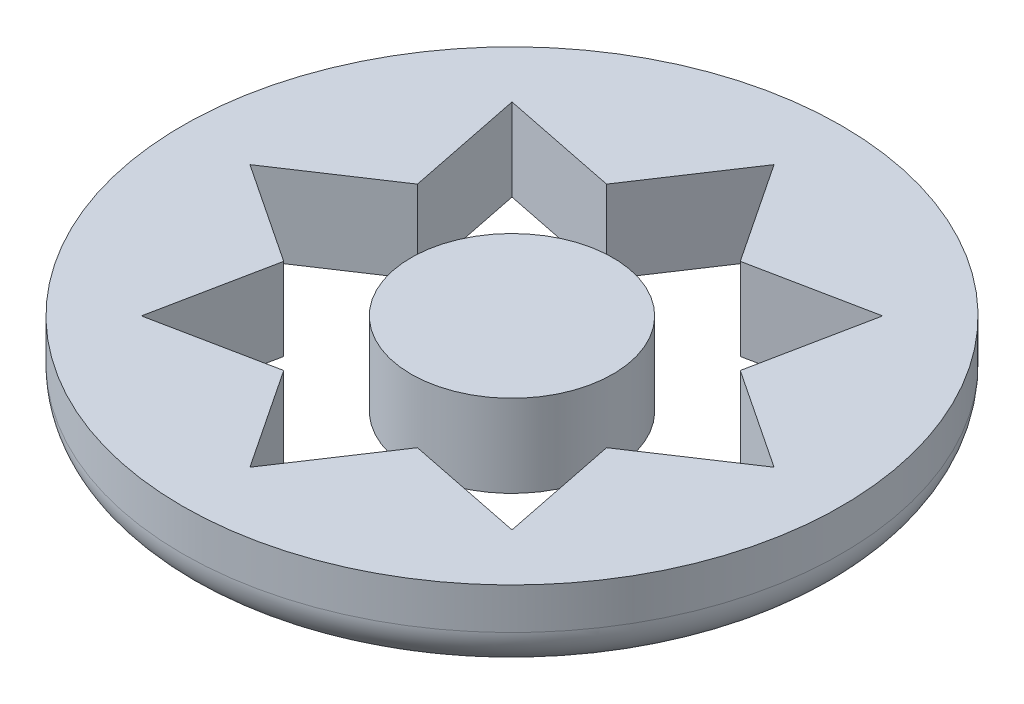
ISO-10303-21;
HEADER;
FILE_DESCRIPTION(('STEP AP214'),'2;1');
FILE_NAME('part.step','',(''),(''),'','','');
FILE_SCHEMA(('AUTOMOTIVE_DESIGN { 1 0 10303 214 1 1 1 1 }'));
ENDSEC;
DATA;
#1=APPLICATION_CONTEXT('core data for automotive mechanical design processes');
#2=APPLICATION_PROTOCOL_DEFINITION('international standard','automotive_design',2000,#1);
#3=PRODUCT_CONTEXT('',#1,'mechanical');
#4=PRODUCT('Part','Part','',(#3));
#5=PRODUCT_RELATED_PRODUCT_CATEGORY('part','',(#4));
#6=PRODUCT_DEFINITION_FORMATION('','',#4);
#7=PRODUCT_DEFINITION_CONTEXT('part definition',#1,'design');
#8=PRODUCT_DEFINITION('design','',#6,#7);
#9=PRODUCT_DEFINITION_SHAPE('','',#8);
#10=(LENGTH_UNIT() NAMED_UNIT(*) SI_UNIT(.MILLI.,.METRE.));
#11=(NAMED_UNIT(*) PLANE_ANGLE_UNIT() SI_UNIT($,.RADIAN.));
#12=(NAMED_UNIT(*) SI_UNIT($,.STERADIAN.) SOLID_ANGLE_UNIT());
#13=UNCERTAINTY_MEASURE_WITH_UNIT(LENGTH_MEASURE(1.E-05),#10,'distance_accuracy_value','');
#14=(GEOMETRIC_REPRESENTATION_CONTEXT(3) GLOBAL_UNCERTAINTY_ASSIGNED_CONTEXT((#13)) GLOBAL_UNIT_ASSIGNED_CONTEXT((#10,
#11,#12)) REPRESENTATION_CONTEXT('',''));
#15=CARTESIAN_POINT('',(0.,0.,0.));
#16=DIRECTION('',(0.,0.,1.));
#17=DIRECTION('',(1.,0.,0.));
#18=AXIS2_PLACEMENT_3D('',#15,#16,#17);
#19=CARTESIAN_POINT('',(0.,-6.92964645562817,0.));
#20=DIRECTION('',(0.,1.,0.));
#21=DIRECTION('',(0.,0.,1.));
#22=AXIS2_PLACEMENT_3D('',#19,#20,#21);
#23=CYLINDRICAL_SURFACE('',#22,2.45);
#24=CARTESIAN_POINT('',(0.,0.,0.));
#25=DIRECTION('',(0.,1.,0.));
#26=DIRECTION('',(0.,0.,1.));
#27=AXIS2_PLACEMENT_3D('',#24,#25,#26);
#28=CIRCLE('',#27,2.45);
#29=CARTESIAN_POINT('',(0.,0.,2.45));
#30=VERTEX_POINT('',#29);
#31=EDGE_CURVE('E11',#30,#30,#28,.F.);
#32=ORIENTED_EDGE('',*,*,#31,.F.);
#33=EDGE_LOOP('',(#32));
#34=FACE_BOUND('',#33,.T.);
#35=CARTESIAN_POINT('',(0.,2.,0.));
#36=DIRECTION('',(0.,1.,0.));
#37=DIRECTION('',(0.,0.,1.));
#38=AXIS2_PLACEMENT_3D('',#35,#36,#37);
#39=CIRCLE('',#38,2.45);
#40=CARTESIAN_POINT('',(0.,2.,2.45));
#41=VERTEX_POINT('',#40);
#42=EDGE_CURVE('E46',#41,#41,#39,.T.);
#43=ORIENTED_EDGE('',*,*,#42,.F.);
#44=EDGE_LOOP('',(#43));
#45=FACE_BOUND('',#44,.T.);
#46=ADVANCED_FACE('F40',(#34,#45),#23,.T.);
#47=CARTESIAN_POINT('',(0.,2.,0.));
#48=DIRECTION('',(0.,1.,0.));
#49=DIRECTION('',(0.,0.,1.));
#50=AXIS2_PLACEMENT_3D('',#47,#48,#49);
#51=PLANE('',#50);
#52=ORIENTED_EDGE('',*,*,#42,.T.);
#53=EDGE_LOOP('',(#52));
#54=FACE_BOUND('',#53,.T.);
#55=ADVANCED_FACE('F52',(#54),#51,.T.);
#56=CARTESIAN_POINT('',(0.,0.,0.));
#57=DIRECTION('',(0.,1.,0.));
#58=DIRECTION('',(0.,0.,1.));
#59=AXIS2_PLACEMENT_3D('',#56,#57,#58);
#60=PLANE('',#59);
#61=ORIENTED_EDGE('',*,*,#31,.T.);
#62=EDGE_LOOP('',(#61));
#63=FACE_BOUND('',#62,.T.);
#64=ADVANCED_FACE('F59',(#63),#60,.F.);
#65=CLOSED_SHELL('',(#46,#55,#64));
#66=MANIFOLD_SOLID_BREP('B2',#65);
#67=CARTESIAN_POINT('',(0.,2.,0.));
#68=DIRECTION('',(0.,1.,0.));
#69=DIRECTION('',(0.,0.,1.));
#70=AXIS2_PLACEMENT_3D('',#67,#68,#69);
#71=PLANE('',#70);
#72=CARTESIAN_POINT('',(0.,2.,0.));
#73=DIRECTION('',(0.,1.,0.));
#74=DIRECTION('',(0.,0.,1.));
#75=AXIS2_PLACEMENT_3D('',#72,#73,#74);
#76=CIRCLE('',#75,8.);
#77=CARTESIAN_POINT('',(0.,2.,8.));
#78=VERTEX_POINT('',#77);
#79=EDGE_CURVE('E209',#78,#78,#76,.T.);
#80=ORIENTED_EDGE('',*,*,#79,.T.);
#81=EDGE_LOOP('',(#80));
#82=FACE_BOUND('',#81,.T.);
#83=DIRECTION('',(0.832981275735844,0.,0.553301178630126));
#84=VECTOR('',#83,1.);
#85=CARTESIAN_POINT('',(-3.91815264163819,2.,1.62295196361452));
#86=LINE('',#85,#84);
#87=CARTESIAN_POINT('',(-6.36146678829633,2.,0.));
#88=VERTEX_POINT('',#87);
#89=CARTESIAN_POINT('',(-3.91815264163819,2.,1.62295196361452));
#90=VERTEX_POINT('',#89);
#91=EDGE_CURVE('E201',#88,#90,#86,.T.);
#92=ORIENTED_EDGE('',*,*,#91,.F.);
#93=DIRECTION('',(-0.832981275735844,0.,0.553301178630126));
#94=VECTOR('',#93,1.);
#95=CARTESIAN_POINT('',(-6.36146678829633,2.,0.));
#96=LINE('',#95,#94);
#97=CARTESIAN_POINT('',(-3.91815264163819,2.,-1.6229519636145));
#98=VERTEX_POINT('',#97);
#99=EDGE_CURVE('E193',#98,#88,#96,.T.);
#100=ORIENTED_EDGE('',*,*,#99,.F.);
#101=DIRECTION('',(0.197763693226366,0.,0.980249724122107));
#102=VECTOR('',#101,1.);
#103=CARTESIAN_POINT('',(-3.91815264163819,2.,-1.6229519636145));
#104=LINE('',#103,#102);
#105=CARTESIAN_POINT('',(-4.49823630429734,2.,-4.49823630429733));
#106=VERTEX_POINT('',#105);
#107=EDGE_CURVE('E242',#106,#98,#104,.T.);
#108=ORIENTED_EDGE('',*,*,#107,.F.);
#109=DIRECTION('',(-0.980249724122108,0.,-0.197763693226365));
#110=VECTOR('',#109,1.);
#111=CARTESIAN_POINT('',(-4.49823630429734,2.,-4.49823630429733));
#112=LINE('',#111,#110);
#113=CARTESIAN_POINT('',(-1.62295196361451,2.,-3.91815264163819));
#114=VERTEX_POINT('',#113);
#115=EDGE_CURVE('E240',#114,#106,#112,.T.);
#116=ORIENTED_EDGE('',*,*,#115,.F.);
#117=DIRECTION('',(-0.553301178630126,0.,0.832981275735844));
#118=VECTOR('',#117,1.);
#119=CARTESIAN_POINT('',(-1.62295196361451,2.,-3.91815264163819));
#120=LINE('',#119,#118);
#121=CARTESIAN_POINT('',(0.,2.,-6.36146678829632));
#122=VERTEX_POINT('',#121);
#123=EDGE_CURVE('E238',#122,#114,#120,.T.);
#124=ORIENTED_EDGE('',*,*,#123,.F.);
#125=DIRECTION('',(-0.553301178630126,0.,-0.832981275735843));
#126=VECTOR('',#125,1.);
#127=CARTESIAN_POINT('',(0.,2.,-6.36146678829632));
#128=LINE('',#127,#126);
#129=CARTESIAN_POINT('',(1.62295196361451,2.,-3.91815264163819));
#130=VERTEX_POINT('',#129);
#131=EDGE_CURVE('E236',#130,#122,#128,.T.);
#132=ORIENTED_EDGE('',*,*,#131,.F.);
#133=DIRECTION('',(-0.980249724122108,0.,0.197763693226365));
#134=VECTOR('',#133,1.);
#135=CARTESIAN_POINT('',(1.62295196361451,2.,-3.91815264163819));
#136=LINE('',#135,#134);
#137=CARTESIAN_POINT('',(4.49823630429734,2.,-4.49823630429733));
#138=VERTEX_POINT('',#137);
#139=EDGE_CURVE('E234',#138,#130,#136,.T.);
#140=ORIENTED_EDGE('',*,*,#139,.F.);
#141=DIRECTION('',(0.197763693226365,0.,-0.980249724122108));
#142=VECTOR('',#141,1.);
#143=CARTESIAN_POINT('',(4.49823630429734,2.,-4.49823630429733));
#144=LINE('',#143,#142);
#145=CARTESIAN_POINT('',(3.91815264163819,2.,-1.6229519636145));
#146=VERTEX_POINT('',#145);
#147=EDGE_CURVE('E232',#146,#138,#144,.T.);
#148=ORIENTED_EDGE('',*,*,#147,.F.);
#149=DIRECTION('',(-0.832981275735844,0.,-0.553301178630126));
#150=VECTOR('',#149,1.);
#151=CARTESIAN_POINT('',(3.91815264163819,2.,-1.6229519636145));
#152=LINE('',#151,#150);
#153=CARTESIAN_POINT('',(6.36146678829633,2.,0.));
#154=VERTEX_POINT('',#153);
#155=EDGE_CURVE('E230',#154,#146,#152,.T.);
#156=ORIENTED_EDGE('',*,*,#155,.F.);
#157=DIRECTION('',(0.832981275735843,0.,-0.553301178630126));
#158=VECTOR('',#157,1.);
#159=CARTESIAN_POINT('',(6.36146678829633,2.,0.));
#160=LINE('',#159,#158);
#161=CARTESIAN_POINT('',(3.9181526416382,2.,1.62295196361452));
#162=VERTEX_POINT('',#161);
#163=EDGE_CURVE('E228',#162,#154,#160,.T.);
#164=ORIENTED_EDGE('',*,*,#163,.F.);
#165=DIRECTION('',(-0.197763693226365,0.,-0.980249724122107));
#166=VECTOR('',#165,1.);
#167=CARTESIAN_POINT('',(3.9181526416382,2.,1.62295196361452));
#168=LINE('',#167,#166);
#169=CARTESIAN_POINT('',(4.49823630429734,2.,4.49823630429735));
#170=VERTEX_POINT('',#169);
#171=EDGE_CURVE('E226',#170,#162,#168,.T.);
#172=ORIENTED_EDGE('',*,*,#171,.F.);
#173=DIRECTION('',(0.980249724122108,0.,0.197763693226365));
#174=VECTOR('',#173,1.);
#175=CARTESIAN_POINT('',(4.49823630429734,2.,4.49823630429735));
#176=LINE('',#175,#174);
#177=CARTESIAN_POINT('',(1.62295196361451,2.,3.9181526416382));
#178=VERTEX_POINT('',#177);
#179=EDGE_CURVE('E224',#178,#170,#176,.T.);
#180=ORIENTED_EDGE('',*,*,#179,.F.);
#181=DIRECTION('',(0.553301178630126,0.,-0.832981275735844));
#182=VECTOR('',#181,1.);
#183=CARTESIAN_POINT('',(1.62295196361451,2.,3.9181526416382));
#184=LINE('',#183,#182);
#185=CARTESIAN_POINT('',(0.,2.,6.36146678829634));
#186=VERTEX_POINT('',#185);
#187=EDGE_CURVE('E222',#186,#178,#184,.T.);
#188=ORIENTED_EDGE('',*,*,#187,.F.);
#189=DIRECTION('',(0.553301178630126,0.,0.832981275735844));
#190=VECTOR('',#189,1.);
#191=CARTESIAN_POINT('',(0.,2.,6.36146678829634));
#192=LINE('',#191,#190);
#193=CARTESIAN_POINT('',(-1.62295196361451,2.,3.9181526416382));
#194=VERTEX_POINT('',#193);
#195=EDGE_CURVE('E220',#194,#186,#192,.T.);
#196=ORIENTED_EDGE('',*,*,#195,.F.);
#197=DIRECTION('',(0.980249724122108,0.,-0.197763693226365));
#198=VECTOR('',#197,1.);
#199=CARTESIAN_POINT('',(-1.62295196361451,2.,3.9181526416382));
#200=LINE('',#199,#198);
#201=CARTESIAN_POINT('',(-4.49823630429734,2.,4.49823630429735));
#202=VERTEX_POINT('',#201);
#203=EDGE_CURVE('E216',#202,#194,#200,.T.);
#204=ORIENTED_EDGE('',*,*,#203,.F.);
#205=DIRECTION('',(-0.197763693226365,0.,0.980249724122107));
#206=VECTOR('',#205,1.);
#207=CARTESIAN_POINT('',(-4.49823630429734,2.,4.49823630429735));
#208=LINE('',#207,#206);
#209=EDGE_CURVE('E214',#90,#202,#208,.T.);
#210=ORIENTED_EDGE('',*,*,#209,.F.);
#211=EDGE_LOOP('',(#92,#100,#108,#116,#124,#132,#140,#148,#156,#164,#172,#180,#188,#196,#204,#210));
#212=FACE_BOUND('',#211,.T.);
#213=ADVANCED_FACE('F80',(#82,#212),#71,.T.);
#214=CARTESIAN_POINT('',(0.,0.,0.));
#215=DIRECTION('',(0.,1.,0.));
#216=DIRECTION('',(0.,0.,1.));
#217=AXIS2_PLACEMENT_3D('',#214,#215,#216);
#218=PLANE('',#217);
#219=CARTESIAN_POINT('',(0.,0.,0.));
#220=DIRECTION('',(0.,1.,0.));
#221=DIRECTION('',(0.,0.,1.));
#222=AXIS2_PLACEMENT_3D('',#219,#220,#221);
#223=CIRCLE('',#222,7.);
#224=CARTESIAN_POINT('',(0.,0.,7.));
#225=VERTEX_POINT('',#224);
#226=EDGE_CURVE('E38',#225,#225,#223,.F.);
#227=ORIENTED_EDGE('',*,*,#226,.T.);
#228=EDGE_LOOP('',(#227));
#229=FACE_BOUND('',#228,.T.);
#230=DIRECTION('',(-0.832981275735844,0.,0.553301178630126));
#231=VECTOR('',#230,1.);
#232=CARTESIAN_POINT('',(-6.36146678829633,0.,0.));
#233=LINE('',#232,#231);
#234=CARTESIAN_POINT('',(-3.91815264163819,0.,-1.6229519636145));
#235=VERTEX_POINT('',#234);
#236=CARTESIAN_POINT('',(-6.36146678829633,0.,0.));
#237=VERTEX_POINT('',#236);
#238=EDGE_CURVE('E103',#235,#237,#233,.T.);
#239=ORIENTED_EDGE('',*,*,#238,.T.);
#240=DIRECTION('',(0.832981275735844,0.,0.553301178630126));
#241=VECTOR('',#240,1.);
#242=CARTESIAN_POINT('',(-3.91815264163819,0.,1.62295196361452));
#243=LINE('',#242,#241);
#244=CARTESIAN_POINT('',(-3.91815264163819,0.,1.62295196361452));
#245=VERTEX_POINT('',#244);
#246=EDGE_CURVE('E208',#237,#245,#243,.T.);
#247=ORIENTED_EDGE('',*,*,#246,.T.);
#248=DIRECTION('',(-0.197763693226365,0.,0.980249724122107));
#249=VECTOR('',#248,1.);
#250=CARTESIAN_POINT('',(-4.49823630429734,0.,4.49823630429735));
#251=LINE('',#250,#249);
#252=CARTESIAN_POINT('',(-4.49823630429734,0.,4.49823630429735));
#253=VERTEX_POINT('',#252);
#254=EDGE_CURVE('E246',#245,#253,#251,.T.);
#255=ORIENTED_EDGE('',*,*,#254,.T.);
#256=DIRECTION('',(0.980249724122108,0.,-0.197763693226365));
#257=VECTOR('',#256,1.);
#258=CARTESIAN_POINT('',(-1.62295196361451,0.,3.9181526416382));
#259=LINE('',#258,#257);
#260=CARTESIAN_POINT('',(-1.62295196361451,0.,3.9181526416382));
#261=VERTEX_POINT('',#260);
#262=EDGE_CURVE('E249',#253,#261,#259,.T.);
#263=ORIENTED_EDGE('',*,*,#262,.T.);
#264=DIRECTION('',(0.553301178630126,0.,0.832981275735844));
#265=VECTOR('',#264,1.);
#266=CARTESIAN_POINT('',(0.,0.,6.36146678829634));
#267=LINE('',#266,#265);
#268=CARTESIAN_POINT('',(0.,0.,6.36146678829634));
#269=VERTEX_POINT('',#268);
#270=EDGE_CURVE('E252',#261,#269,#267,.T.);
#271=ORIENTED_EDGE('',*,*,#270,.T.);
#272=DIRECTION('',(0.553301178630126,0.,-0.832981275735844));
#273=VECTOR('',#272,1.);
#274=CARTESIAN_POINT('',(1.62295196361451,0.,3.9181526416382));
#275=LINE('',#274,#273);
#276=CARTESIAN_POINT('',(1.62295196361451,0.,3.9181526416382));
#277=VERTEX_POINT('',#276);
#278=EDGE_CURVE('E255',#269,#277,#275,.T.);
#279=ORIENTED_EDGE('',*,*,#278,.T.);
#280=DIRECTION('',(0.980249724122108,0.,0.197763693226365));
#281=VECTOR('',#280,1.);
#282=CARTESIAN_POINT('',(4.49823630429734,0.,4.49823630429735));
#283=LINE('',#282,#281);
#284=CARTESIAN_POINT('',(4.49823630429734,0.,4.49823630429735));
#285=VERTEX_POINT('',#284);
#286=EDGE_CURVE('E258',#277,#285,#283,.T.);
#287=ORIENTED_EDGE('',*,*,#286,.T.);
#288=DIRECTION('',(-0.197763693226365,0.,-0.980249724122107));
#289=VECTOR('',#288,1.);
#290=CARTESIAN_POINT('',(3.9181526416382,0.,1.62295196361452));
#291=LINE('',#290,#289);
#292=CARTESIAN_POINT('',(3.9181526416382,0.,1.62295196361452));
#293=VERTEX_POINT('',#292);
#294=EDGE_CURVE('E261',#285,#293,#291,.T.);
#295=ORIENTED_EDGE('',*,*,#294,.T.);
#296=DIRECTION('',(0.832981275735843,0.,-0.553301178630126));
#297=VECTOR('',#296,1.);
#298=CARTESIAN_POINT('',(6.36146678829633,0.,0.));
#299=LINE('',#298,#297);
#300=CARTESIAN_POINT('',(6.36146678829633,0.,0.));
#301=VERTEX_POINT('',#300);
#302=EDGE_CURVE('E264',#293,#301,#299,.T.);
#303=ORIENTED_EDGE('',*,*,#302,.T.);
#304=DIRECTION('',(-0.832981275735844,0.,-0.553301178630126));
#305=VECTOR('',#304,1.);
#306=CARTESIAN_POINT('',(3.91815264163819,0.,-1.6229519636145));
#307=LINE('',#306,#305);
#308=CARTESIAN_POINT('',(3.91815264163819,0.,-1.6229519636145));
#309=VERTEX_POINT('',#308);
#310=EDGE_CURVE('E267',#301,#309,#307,.T.);
#311=ORIENTED_EDGE('',*,*,#310,.T.);
#312=DIRECTION('',(0.197763693226365,0.,-0.980249724122108));
#313=VECTOR('',#312,1.);
#314=CARTESIAN_POINT('',(4.49823630429734,0.,-4.49823630429733));
#315=LINE('',#314,#313);
#316=CARTESIAN_POINT('',(4.49823630429734,0.,-4.49823630429733));
#317=VERTEX_POINT('',#316);
#318=EDGE_CURVE('E270',#309,#317,#315,.T.);
#319=ORIENTED_EDGE('',*,*,#318,.T.);
#320=DIRECTION('',(-0.980249724122108,0.,0.197763693226365));
#321=VECTOR('',#320,1.);
#322=CARTESIAN_POINT('',(1.62295196361451,0.,-3.91815264163819));
#323=LINE('',#322,#321);
#324=CARTESIAN_POINT('',(1.62295196361451,0.,-3.91815264163819));
#325=VERTEX_POINT('',#324);
#326=EDGE_CURVE('E273',#317,#325,#323,.T.);
#327=ORIENTED_EDGE('',*,*,#326,.T.);
#328=DIRECTION('',(-0.553301178630126,0.,-0.832981275735843));
#329=VECTOR('',#328,1.);
#330=CARTESIAN_POINT('',(0.,0.,-6.36146678829632));
#331=LINE('',#330,#329);
#332=CARTESIAN_POINT('',(0.,0.,-6.36146678829632));
#333=VERTEX_POINT('',#332);
#334=EDGE_CURVE('E276',#325,#333,#331,.T.);
#335=ORIENTED_EDGE('',*,*,#334,.T.);
#336=DIRECTION('',(-0.553301178630126,0.,0.832981275735844));
#337=VECTOR('',#336,1.);
#338=CARTESIAN_POINT('',(-1.62295196361451,0.,-3.91815264163819));
#339=LINE('',#338,#337);
#340=CARTESIAN_POINT('',(-1.62295196361451,0.,-3.91815264163819));
#341=VERTEX_POINT('',#340);
#342=EDGE_CURVE('E279',#333,#341,#339,.T.);
#343=ORIENTED_EDGE('',*,*,#342,.T.);
#344=DIRECTION('',(-0.980249724122108,0.,-0.197763693226365));
#345=VECTOR('',#344,1.);
#346=CARTESIAN_POINT('',(-4.49823630429734,0.,-4.49823630429733));
#347=LINE('',#346,#345);
#348=CARTESIAN_POINT('',(-4.49823630429734,0.,-4.49823630429733));
#349=VERTEX_POINT('',#348);
#350=EDGE_CURVE('E282',#341,#349,#347,.T.);
#351=ORIENTED_EDGE('',*,*,#350,.T.);
#352=DIRECTION('',(0.197763693226366,0.,0.980249724122107));
#353=VECTOR('',#352,1.);
#354=CARTESIAN_POINT('',(-3.91815264163819,0.,-1.6229519636145));
#355=LINE('',#354,#353);
#356=EDGE_CURVE('E202',#349,#235,#355,.T.);
#357=ORIENTED_EDGE('',*,*,#356,.T.);
#358=EDGE_LOOP('',(#239,#247,#255,#263,#271,#279,#287,#295,#303,#311,#319,#327,#335,#343,#351,#357));
#359=FACE_BOUND('',#358,.T.);
#360=ADVANCED_FACE('F331',(#229,#359),#218,.F.);
#361=CARTESIAN_POINT('',(0.,2.,0.));
#362=DIRECTION('',(0.,-1.,0.));
#363=DIRECTION('',(0.,0.,-1.));
#364=AXIS2_PLACEMENT_3D('',#361,#362,#363);
#365=CYLINDRICAL_SURFACE('',#364,8.);
#366=CARTESIAN_POINT('',(0.,1.,0.));
#367=DIRECTION('',(0.,1.,0.));
#368=DIRECTION('',(0.,0.,1.));
#369=AXIS2_PLACEMENT_3D('',#366,#367,#368);
#370=CIRCLE('',#369,8.);
#371=CARTESIAN_POINT('',(0.,1.,8.));
#372=VERTEX_POINT('',#371);
#373=EDGE_CURVE('E88',#372,#372,#370,.T.);
#374=ORIENTED_EDGE('',*,*,#373,.T.);
#375=EDGE_LOOP('',(#374));
#376=FACE_BOUND('',#375,.T.);
#377=ORIENTED_EDGE('',*,*,#79,.F.);
#378=EDGE_LOOP('',(#377));
#379=FACE_BOUND('',#378,.T.);
#380=ADVANCED_FACE('F318',(#376,#379),#365,.T.);
#381=CARTESIAN_POINT('',(-6.36146678829633,2.,0.));
#382=DIRECTION('',(0.553301178630126,0.,0.832981275735844));
#383=DIRECTION('',(0.832981275735843,0.,-0.553301178630126));
#384=AXIS2_PLACEMENT_3D('',#381,#382,#383);
#385=PLANE('',#384);
#386=ORIENTED_EDGE('',*,*,#238,.F.);
#387=DIRECTION('',(0.,-1.,0.));
#388=VECTOR('',#387,1.);
#389=CARTESIAN_POINT('',(-3.91815264163819,2.,-1.6229519636145));
#390=LINE('',#389,#388);
#391=EDGE_CURVE('E197',#98,#235,#390,.T.);
#392=ORIENTED_EDGE('',*,*,#391,.F.);
#393=ORIENTED_EDGE('',*,*,#99,.T.);
#394=DIRECTION('',(0.,-1.,0.));
#395=VECTOR('',#394,1.);
#396=CARTESIAN_POINT('',(-6.36146678829633,2.,0.));
#397=LINE('',#396,#395);
#398=EDGE_CURVE('E196',#88,#237,#397,.T.);
#399=ORIENTED_EDGE('',*,*,#398,.T.);
#400=EDGE_LOOP('',(#386,#392,#393,#399));
#401=FACE_BOUND('',#400,.T.);
#402=ADVANCED_FACE('F195',(#401),#385,.T.);
#403=CARTESIAN_POINT('',(-3.91815264163819,2.,1.62295196361452));
#404=DIRECTION('',(0.553301178630126,0.,-0.832981275735844));
#405=DIRECTION('',(-0.832981275735844,0.,-0.553301178630126));
#406=AXIS2_PLACEMENT_3D('',#403,#404,#405);
#407=PLANE('',#406);
#408=ORIENTED_EDGE('',*,*,#246,.F.);
#409=ORIENTED_EDGE('',*,*,#398,.F.);
#410=ORIENTED_EDGE('',*,*,#91,.T.);
#411=DIRECTION('',(0.,-1.,0.));
#412=VECTOR('',#411,1.);
#413=CARTESIAN_POINT('',(-3.91815264163819,2.,1.62295196361452));
#414=LINE('',#413,#412);
#415=EDGE_CURVE('E210',#90,#245,#414,.T.);
#416=ORIENTED_EDGE('',*,*,#415,.T.);
#417=EDGE_LOOP('',(#408,#409,#410,#416));
#418=FACE_BOUND('',#417,.T.);
#419=ADVANCED_FACE('F205',(#418),#407,.T.);
#420=CARTESIAN_POINT('',(-4.49823630429734,2.,4.49823630429735));
#421=DIRECTION('',(0.980249724122108,0.,0.197763693226365));
#422=DIRECTION('',(0.197763693226365,0.,-0.980249724122108));
#423=AXIS2_PLACEMENT_3D('',#420,#421,#422);
#424=PLANE('',#423);
#425=ORIENTED_EDGE('',*,*,#254,.F.);
#426=ORIENTED_EDGE('',*,*,#415,.F.);
#427=ORIENTED_EDGE('',*,*,#209,.T.);
#428=DIRECTION('',(0.,-1.,0.));
#429=VECTOR('',#428,1.);
#430=CARTESIAN_POINT('',(-4.49823630429734,2.,4.49823630429735));
#431=LINE('',#430,#429);
#432=EDGE_CURVE('E311',#202,#253,#431,.T.);
#433=ORIENTED_EDGE('',*,*,#432,.T.);
#434=EDGE_LOOP('',(#425,#426,#427,#433));
#435=FACE_BOUND('',#434,.T.);
#436=ADVANCED_FACE('F348',(#435),#424,.T.);
#437=CARTESIAN_POINT('',(-1.62295196361451,2.,3.9181526416382));
#438=DIRECTION('',(-0.197763693226365,0.,-0.980249724122108));
#439=DIRECTION('',(-0.980249724122108,0.,0.197763693226365));
#440=AXIS2_PLACEMENT_3D('',#437,#438,#439);
#441=PLANE('',#440);
#442=ORIENTED_EDGE('',*,*,#262,.F.);
#443=ORIENTED_EDGE('',*,*,#432,.F.);
#444=ORIENTED_EDGE('',*,*,#203,.T.);
#445=DIRECTION('',(0.,-1.,0.));
#446=VECTOR('',#445,1.);
#447=CARTESIAN_POINT('',(-1.62295196361451,2.,3.9181526416382));
#448=LINE('',#447,#446);
#449=EDGE_CURVE('E309',#194,#261,#448,.T.);
#450=ORIENTED_EDGE('',*,*,#449,.T.);
#451=EDGE_LOOP('',(#442,#443,#444,#450));
#452=FACE_BOUND('',#451,.T.);
#453=ADVANCED_FACE('F352',(#452),#441,.T.);
#454=CARTESIAN_POINT('',(0.,2.,6.36146678829634));
#455=DIRECTION('',(0.832981275735844,0.,-0.553301178630126));
#456=DIRECTION('',(-0.553301178630126,0.,-0.832981275735844));
#457=AXIS2_PLACEMENT_3D('',#454,#455,#456);
#458=PLANE('',#457);
#459=ORIENTED_EDGE('',*,*,#270,.F.);
#460=ORIENTED_EDGE('',*,*,#449,.F.);
#461=ORIENTED_EDGE('',*,*,#195,.T.);
#462=DIRECTION('',(0.,-1.,0.));
#463=VECTOR('',#462,1.);
#464=CARTESIAN_POINT('',(0.,2.,6.36146678829634));
#465=LINE('',#464,#463);
#466=EDGE_CURVE('E307',#186,#269,#465,.T.);
#467=ORIENTED_EDGE('',*,*,#466,.T.);
#468=EDGE_LOOP('',(#459,#460,#461,#467));
#469=FACE_BOUND('',#468,.T.);
#470=ADVANCED_FACE('F358',(#469),#458,.T.);
#471=CARTESIAN_POINT('',(1.62295196361451,2.,3.9181526416382));
#472=DIRECTION('',(-0.832981275735844,0.,-0.553301178630126));
#473=DIRECTION('',(-0.553301178630126,0.,0.832981275735844));
#474=AXIS2_PLACEMENT_3D('',#471,#472,#473);
#475=PLANE('',#474);
#476=ORIENTED_EDGE('',*,*,#278,.F.);
#477=ORIENTED_EDGE('',*,*,#466,.F.);
#478=ORIENTED_EDGE('',*,*,#187,.T.);
#479=DIRECTION('',(0.,-1.,0.));
#480=VECTOR('',#479,1.);
#481=CARTESIAN_POINT('',(1.62295196361451,2.,3.9181526416382));
#482=LINE('',#481,#480);
#483=EDGE_CURVE('E305',#178,#277,#482,.T.);
#484=ORIENTED_EDGE('',*,*,#483,.T.);
#485=EDGE_LOOP('',(#476,#477,#478,#484));
#486=FACE_BOUND('',#485,.T.);
#487=ADVANCED_FACE('F362',(#486),#475,.T.);
#488=CARTESIAN_POINT('',(4.49823630429734,2.,4.49823630429735));
#489=DIRECTION('',(0.197763693226365,0.,-0.980249724122108));
#490=DIRECTION('',(-0.980249724122108,0.,-0.197763693226365));
#491=AXIS2_PLACEMENT_3D('',#488,#489,#490);
#492=PLANE('',#491);
#493=ORIENTED_EDGE('',*,*,#286,.F.);
#494=ORIENTED_EDGE('',*,*,#483,.F.);
#495=ORIENTED_EDGE('',*,*,#179,.T.);
#496=DIRECTION('',(0.,-1.,0.));
#497=VECTOR('',#496,1.);
#498=CARTESIAN_POINT('',(4.49823630429734,2.,4.49823630429735));
#499=LINE('',#498,#497);
#500=EDGE_CURVE('E303',#170,#285,#499,.T.);
#501=ORIENTED_EDGE('',*,*,#500,.T.);
#502=EDGE_LOOP('',(#493,#494,#495,#501));
#503=FACE_BOUND('',#502,.T.);
#504=ADVANCED_FACE('F366',(#503),#492,.T.);
#505=CARTESIAN_POINT('',(3.9181526416382,2.,1.62295196361452));
#506=DIRECTION('',(-0.980249724122108,0.,0.197763693226365));
#507=DIRECTION('',(0.197763693226365,0.,0.980249724122108));
#508=AXIS2_PLACEMENT_3D('',#505,#506,#507);
#509=PLANE('',#508);
#510=ORIENTED_EDGE('',*,*,#294,.F.);
#511=ORIENTED_EDGE('',*,*,#500,.F.);
#512=ORIENTED_EDGE('',*,*,#171,.T.);
#513=DIRECTION('',(0.,-1.,0.));
#514=VECTOR('',#513,1.);
#515=CARTESIAN_POINT('',(3.9181526416382,2.,1.62295196361452));
#516=LINE('',#515,#514);
#517=EDGE_CURVE('E301',#162,#293,#516,.T.);
#518=ORIENTED_EDGE('',*,*,#517,.T.);
#519=EDGE_LOOP('',(#510,#511,#512,#518));
#520=FACE_BOUND('',#519,.T.);
#521=ADVANCED_FACE('F370',(#520),#509,.T.);
#522=CARTESIAN_POINT('',(6.36146678829633,2.,0.));
#523=DIRECTION('',(-0.553301178630126,0.,-0.832981275735843));
#524=DIRECTION('',(-0.832981275735843,0.,0.553301178630126));
#525=AXIS2_PLACEMENT_3D('',#522,#523,#524);
#526=PLANE('',#525);
#527=ORIENTED_EDGE('',*,*,#302,.F.);
#528=ORIENTED_EDGE('',*,*,#517,.F.);
#529=ORIENTED_EDGE('',*,*,#163,.T.);
#530=DIRECTION('',(0.,-1.,0.));
#531=VECTOR('',#530,1.);
#532=CARTESIAN_POINT('',(6.36146678829633,2.,0.));
#533=LINE('',#532,#531);
#534=EDGE_CURVE('E299',#154,#301,#533,.T.);
#535=ORIENTED_EDGE('',*,*,#534,.T.);
#536=EDGE_LOOP('',(#527,#528,#529,#535));
#537=FACE_BOUND('',#536,.T.);
#538=ADVANCED_FACE('F374',(#537),#526,.T.);
#539=CARTESIAN_POINT('',(3.91815264163819,2.,-1.6229519636145));
#540=DIRECTION('',(-0.553301178630126,0.,0.832981275735844));
#541=DIRECTION('',(0.832981275735844,0.,0.553301178630126));
#542=AXIS2_PLACEMENT_3D('',#539,#540,#541);
#543=PLANE('',#542);
#544=ORIENTED_EDGE('',*,*,#310,.F.);
#545=ORIENTED_EDGE('',*,*,#534,.F.);
#546=ORIENTED_EDGE('',*,*,#155,.T.);
#547=DIRECTION('',(0.,-1.,0.));
#548=VECTOR('',#547,1.);
#549=CARTESIAN_POINT('',(3.91815264163819,2.,-1.6229519636145));
#550=LINE('',#549,#548);
#551=EDGE_CURVE('E297',#146,#309,#550,.T.);
#552=ORIENTED_EDGE('',*,*,#551,.T.);
#553=EDGE_LOOP('',(#544,#545,#546,#552));
#554=FACE_BOUND('',#553,.T.);
#555=ADVANCED_FACE('F378',(#554),#543,.T.);
#556=CARTESIAN_POINT('',(4.49823630429734,2.,-4.49823630429733));
#557=DIRECTION('',(-0.980249724122108,0.,-0.197763693226365));
#558=DIRECTION('',(-0.197763693226365,0.,0.980249724122108));
#559=AXIS2_PLACEMENT_3D('',#556,#557,#558);
#560=PLANE('',#559);
#561=ORIENTED_EDGE('',*,*,#318,.F.);
#562=ORIENTED_EDGE('',*,*,#551,.F.);
#563=ORIENTED_EDGE('',*,*,#147,.T.);
#564=DIRECTION('',(0.,-1.,0.));
#565=VECTOR('',#564,1.);
#566=CARTESIAN_POINT('',(4.49823630429734,2.,-4.49823630429733));
#567=LINE('',#566,#565);
#568=EDGE_CURVE('E295',#138,#317,#567,.T.);
#569=ORIENTED_EDGE('',*,*,#568,.T.);
#570=EDGE_LOOP('',(#561,#562,#563,#569));
#571=FACE_BOUND('',#570,.T.);
#572=ADVANCED_FACE('F382',(#571),#560,.T.);
#573=CARTESIAN_POINT('',(1.62295196361451,2.,-3.91815264163819));
#574=DIRECTION('',(0.197763693226365,0.,0.980249724122108));
#575=DIRECTION('',(0.980249724122108,0.,-0.197763693226365));
#576=AXIS2_PLACEMENT_3D('',#573,#574,#575);
#577=PLANE('',#576);
#578=ORIENTED_EDGE('',*,*,#326,.F.);
#579=ORIENTED_EDGE('',*,*,#568,.F.);
#580=ORIENTED_EDGE('',*,*,#139,.T.);
#581=DIRECTION('',(0.,-1.,0.));
#582=VECTOR('',#581,1.);
#583=CARTESIAN_POINT('',(1.62295196361451,2.,-3.91815264163819));
#584=LINE('',#583,#582);
#585=EDGE_CURVE('E293',#130,#325,#584,.T.);
#586=ORIENTED_EDGE('',*,*,#585,.T.);
#587=EDGE_LOOP('',(#578,#579,#580,#586));
#588=FACE_BOUND('',#587,.T.);
#589=ADVANCED_FACE('F386',(#588),#577,.T.);
#590=CARTESIAN_POINT('',(0.,2.,-6.36146678829632));
#591=DIRECTION('',(-0.832981275735843,0.,0.553301178630126));
#592=DIRECTION('',(0.553301178630126,0.,0.832981275735843));
#593=AXIS2_PLACEMENT_3D('',#590,#591,#592);
#594=PLANE('',#593);
#595=ORIENTED_EDGE('',*,*,#334,.F.);
#596=ORIENTED_EDGE('',*,*,#585,.F.);
#597=ORIENTED_EDGE('',*,*,#131,.T.);
#598=DIRECTION('',(0.,-1.,0.));
#599=VECTOR('',#598,1.);
#600=CARTESIAN_POINT('',(0.,2.,-6.36146678829632));
#601=LINE('',#600,#599);
#602=EDGE_CURVE('E291',#122,#333,#601,.T.);
#603=ORIENTED_EDGE('',*,*,#602,.T.);
#604=EDGE_LOOP('',(#595,#596,#597,#603));
#605=FACE_BOUND('',#604,.T.);
#606=ADVANCED_FACE('F390',(#605),#594,.T.);
#607=CARTESIAN_POINT('',(-1.62295196361451,2.,-3.91815264163819));
#608=DIRECTION('',(0.832981275735844,0.,0.553301178630126));
#609=DIRECTION('',(0.553301178630126,0.,-0.832981275735844));
#610=AXIS2_PLACEMENT_3D('',#607,#608,#609);
#611=PLANE('',#610);
#612=ORIENTED_EDGE('',*,*,#342,.F.);
#613=ORIENTED_EDGE('',*,*,#602,.F.);
#614=ORIENTED_EDGE('',*,*,#123,.T.);
#615=DIRECTION('',(0.,-1.,0.));
#616=VECTOR('',#615,1.);
#617=CARTESIAN_POINT('',(-1.62295196361451,2.,-3.91815264163819));
#618=LINE('',#617,#616);
#619=EDGE_CURVE('E289',#114,#341,#618,.T.);
#620=ORIENTED_EDGE('',*,*,#619,.T.);
#621=EDGE_LOOP('',(#612,#613,#614,#620));
#622=FACE_BOUND('',#621,.T.);
#623=ADVANCED_FACE('F394',(#622),#611,.T.);
#624=CARTESIAN_POINT('',(-4.49823630429734,2.,-4.49823630429733));
#625=DIRECTION('',(-0.197763693226365,0.,0.980249724122108));
#626=DIRECTION('',(0.980249724122108,0.,0.197763693226365));
#627=AXIS2_PLACEMENT_3D('',#624,#625,#626);
#628=PLANE('',#627);
#629=ORIENTED_EDGE('',*,*,#350,.F.);
#630=ORIENTED_EDGE('',*,*,#619,.F.);
#631=ORIENTED_EDGE('',*,*,#115,.T.);
#632=DIRECTION('',(0.,-1.,0.));
#633=VECTOR('',#632,1.);
#634=CARTESIAN_POINT('',(-4.49823630429734,2.,-4.49823630429733));
#635=LINE('',#634,#633);
#636=EDGE_CURVE('E95',#106,#349,#635,.T.);
#637=ORIENTED_EDGE('',*,*,#636,.T.);
#638=EDGE_LOOP('',(#629,#630,#631,#637));
#639=FACE_BOUND('',#638,.T.);
#640=ADVANCED_FACE('F327',(#639),#628,.T.);
#641=CARTESIAN_POINT('',(-3.91815264163819,2.,-1.6229519636145));
#642=DIRECTION('',(0.980249724122108,0.,-0.197763693226366));
#643=DIRECTION('',(-0.197763693226366,0.,-0.980249724122108));
#644=AXIS2_PLACEMENT_3D('',#641,#642,#643);
#645=PLANE('',#644);
#646=ORIENTED_EDGE('',*,*,#356,.F.);
#647=ORIENTED_EDGE('',*,*,#636,.F.);
#648=ORIENTED_EDGE('',*,*,#107,.T.);
#649=ORIENTED_EDGE('',*,*,#391,.T.);
#650=EDGE_LOOP('',(#646,#647,#648,#649));
#651=FACE_BOUND('',#650,.T.);
#652=ADVANCED_FACE('F322',(#651),#645,.T.);
#653=CARTESIAN_POINT('',(0.,1.,0.));
#654=DIRECTION('',(0.,1.,0.));
#655=DIRECTION('',(0.,0.,1.));
#656=AXIS2_PLACEMENT_3D('',#653,#654,#655);
#657=TOROIDAL_SURFACE('',#656,7.,1.);
#658=ORIENTED_EDGE('',*,*,#226,.F.);
#659=EDGE_LOOP('',(#658));
#660=FACE_BOUND('',#659,.T.);
#661=ORIENTED_EDGE('',*,*,#373,.F.);
#662=EDGE_LOOP('',(#661));
#663=FACE_BOUND('',#662,.T.);
#664=ADVANCED_FACE('F82',(#660,#663),#657,.T.);
#665=CLOSED_SHELL('',(#213,#360,#380,#402,#419,#436,#453,#470,#487,#504,#521,#538,#555,#572,
#589,#606,#623,#640,#652,#664));
#666=MANIFOLD_SOLID_BREP('B6',#665);
#667=ADVANCED_BREP_SHAPE_REPRESENTATION('',(#18,#66,#666),#14);
#668=SHAPE_DEFINITION_REPRESENTATION(#9,#667);
ENDSEC;
END-ISO-10303-21;
